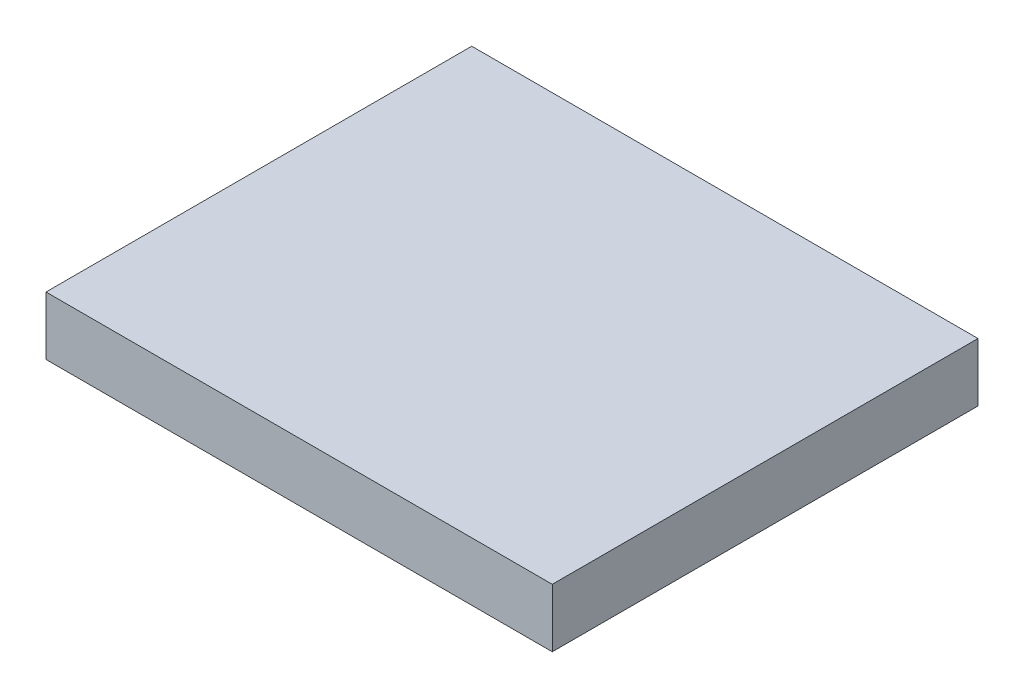
ISO-10303-21;
HEADER;
FILE_DESCRIPTION(('STEP AP214'),'2;1');
FILE_NAME('part.step','',(''),(''),'','','');
FILE_SCHEMA(('AUTOMOTIVE_DESIGN { 1 0 10303 214 1 1 1 1 }'));
ENDSEC;
DATA;
#1=APPLICATION_CONTEXT('core data for automotive mechanical design processes');
#2=APPLICATION_PROTOCOL_DEFINITION('international standard','automotive_design',2000,#1);
#3=PRODUCT_CONTEXT('',#1,'mechanical');
#4=PRODUCT('Part','Part','',(#3));
#5=PRODUCT_RELATED_PRODUCT_CATEGORY('part','',(#4));
#6=PRODUCT_DEFINITION_FORMATION('','',#4);
#7=PRODUCT_DEFINITION_CONTEXT('part definition',#1,'design');
#8=PRODUCT_DEFINITION('design','',#6,#7);
#9=PRODUCT_DEFINITION_SHAPE('','',#8);
#10=(LENGTH_UNIT() NAMED_UNIT(*) SI_UNIT(.MILLI.,.METRE.));
#11=(NAMED_UNIT(*) PLANE_ANGLE_UNIT() SI_UNIT($,.RADIAN.));
#12=(NAMED_UNIT(*) SI_UNIT($,.STERADIAN.) SOLID_ANGLE_UNIT());
#13=UNCERTAINTY_MEASURE_WITH_UNIT(LENGTH_MEASURE(1.E-05),#10,'distance_accuracy_value','');
#14=(GEOMETRIC_REPRESENTATION_CONTEXT(3) GLOBAL_UNCERTAINTY_ASSIGNED_CONTEXT((#13)) GLOBAL_UNIT_ASSIGNED_CONTEXT((#10,
#11,#12)) REPRESENTATION_CONTEXT('',''));
#15=CARTESIAN_POINT('',(0.,0.,0.));
#16=DIRECTION('',(0.,0.,1.));
#17=DIRECTION('',(1.,0.,0.));
#18=AXIS2_PLACEMENT_3D('',#15,#16,#17);
#19=CARTESIAN_POINT('',(110.,25.4,-92.5));
#20=DIRECTION('',(-1.,0.,0.));
#21=DIRECTION('',(0.,0.,1.));
#22=AXIS2_PLACEMENT_3D('',#19,#20,#21);
#23=PLANE('',#22);
#24=DIRECTION('',(0.,0.,-1.));
#25=VECTOR('',#24,1.);
#26=CARTESIAN_POINT('',(110.,0.,-92.5));
#27=LINE('',#26,#25);
#28=CARTESIAN_POINT('',(110.,0.,92.5));
#29=VERTEX_POINT('',#28);
#30=CARTESIAN_POINT('',(110.,0.,-92.5));
#31=VERTEX_POINT('',#30);
#32=EDGE_CURVE('E96',#29,#31,#27,.T.);
#33=ORIENTED_EDGE('',*,*,#32,.T.);
#34=DIRECTION('',(0.,-1.,0.));
#35=VECTOR('',#34,1.);
#36=CARTESIAN_POINT('',(110.,25.4,-92.5));
#37=LINE('',#36,#35);
#38=CARTESIAN_POINT('',(110.,25.4,-92.5));
#39=VERTEX_POINT('',#38);
#40=EDGE_CURVE('E11',#39,#31,#37,.T.);
#41=ORIENTED_EDGE('',*,*,#40,.F.);
#42=DIRECTION('',(0.,0.,-1.));
#43=VECTOR('',#42,1.);
#44=CARTESIAN_POINT('',(110.,25.4,-92.5));
#45=LINE('',#44,#43);
#46=CARTESIAN_POINT('',(110.,25.4,92.5));
#47=VERTEX_POINT('',#46);
#48=EDGE_CURVE('E84',#47,#39,#45,.T.);
#49=ORIENTED_EDGE('',*,*,#48,.F.);
#50=DIRECTION('',(0.,-1.,0.));
#51=VECTOR('',#50,1.);
#52=CARTESIAN_POINT('',(110.,25.4,92.5));
#53=LINE('',#52,#51);
#54=EDGE_CURVE('E92',#47,#29,#53,.T.);
#55=ORIENTED_EDGE('',*,*,#54,.T.);
#56=EDGE_LOOP('',(#33,#41,#49,#55));
#57=FACE_BOUND('',#56,.T.);
#58=ADVANCED_FACE('F33',(#57),#23,.F.);
#59=CARTESIAN_POINT('',(-110.,25.4,-92.5));
#60=DIRECTION('',(0.,0.,1.));
#61=DIRECTION('',(1.,0.,0.));
#62=AXIS2_PLACEMENT_3D('',#59,#60,#61);
#63=PLANE('',#62);
#64=DIRECTION('',(-1.,0.,0.));
#65=VECTOR('',#64,1.);
#66=CARTESIAN_POINT('',(-110.,0.,-92.5));
#67=LINE('',#66,#65);
#68=CARTESIAN_POINT('',(-110.,0.,-92.5));
#69=VERTEX_POINT('',#68);
#70=EDGE_CURVE('E88',#31,#69,#67,.T.);
#71=ORIENTED_EDGE('',*,*,#70,.T.);
#72=DIRECTION('',(0.,-1.,0.));
#73=VECTOR('',#72,1.);
#74=CARTESIAN_POINT('',(-110.,25.4,-92.5));
#75=LINE('',#74,#73);
#76=CARTESIAN_POINT('',(-110.,25.4,-92.5));
#77=VERTEX_POINT('',#76);
#78=EDGE_CURVE('E41',#77,#69,#75,.T.);
#79=ORIENTED_EDGE('',*,*,#78,.F.);
#80=DIRECTION('',(-1.,0.,0.));
#81=VECTOR('',#80,1.);
#82=CARTESIAN_POINT('',(-110.,25.4,-92.5));
#83=LINE('',#82,#81);
#84=EDGE_CURVE('E79',#39,#77,#83,.T.);
#85=ORIENTED_EDGE('',*,*,#84,.F.);
#86=ORIENTED_EDGE('',*,*,#40,.T.);
#87=EDGE_LOOP('',(#71,#79,#85,#86));
#88=FACE_BOUND('',#87,.T.);
#89=ADVANCED_FACE('F87',(#88),#63,.F.);
#90=CARTESIAN_POINT('',(-110.,25.4,-92.5));
#91=DIRECTION('',(1.,0.,0.));
#92=DIRECTION('',(0.,0.,-1.));
#93=AXIS2_PLACEMENT_3D('',#90,#91,#92);
#94=PLANE('',#93);
#95=DIRECTION('',(0.,0.,1.));
#96=VECTOR('',#95,1.);
#97=CARTESIAN_POINT('',(-110.,0.,-92.5));
#98=LINE('',#97,#96);
#99=CARTESIAN_POINT('',(-110.,0.,92.5));
#100=VERTEX_POINT('',#99);
#101=EDGE_CURVE('E66',#69,#100,#98,.T.);
#102=ORIENTED_EDGE('',*,*,#101,.T.);
#103=DIRECTION('',(0.,-1.,0.));
#104=VECTOR('',#103,1.);
#105=CARTESIAN_POINT('',(-110.,25.4,92.5));
#106=LINE('',#105,#104);
#107=CARTESIAN_POINT('',(-110.,25.4,92.5));
#108=VERTEX_POINT('',#107);
#109=EDGE_CURVE('E89',#108,#100,#106,.T.);
#110=ORIENTED_EDGE('',*,*,#109,.F.);
#111=DIRECTION('',(0.,0.,1.));
#112=VECTOR('',#111,1.);
#113=CARTESIAN_POINT('',(-110.,25.4,-92.5));
#114=LINE('',#113,#112);
#115=EDGE_CURVE('E82',#77,#108,#114,.T.);
#116=ORIENTED_EDGE('',*,*,#115,.F.);
#117=ORIENTED_EDGE('',*,*,#78,.T.);
#118=EDGE_LOOP('',(#102,#110,#116,#117));
#119=FACE_BOUND('',#118,.T.);
#120=ADVANCED_FACE('F90',(#119),#94,.F.);
#121=CARTESIAN_POINT('',(-110.,25.4,92.5));
#122=DIRECTION('',(0.,0.,-1.));
#123=DIRECTION('',(-1.,0.,0.));
#124=AXIS2_PLACEMENT_3D('',#121,#122,#123);
#125=PLANE('',#124);
#126=DIRECTION('',(1.,0.,0.));
#127=VECTOR('',#126,1.);
#128=CARTESIAN_POINT('',(-110.,0.,92.5));
#129=LINE('',#128,#127);
#130=EDGE_CURVE('E72',#100,#29,#129,.T.);
#131=ORIENTED_EDGE('',*,*,#130,.T.);
#132=ORIENTED_EDGE('',*,*,#54,.F.);
#133=DIRECTION('',(1.,0.,0.));
#134=VECTOR('',#133,1.);
#135=CARTESIAN_POINT('',(-110.,25.4,92.5));
#136=LINE('',#135,#134);
#137=EDGE_CURVE('E49',#108,#47,#136,.T.);
#138=ORIENTED_EDGE('',*,*,#137,.F.);
#139=ORIENTED_EDGE('',*,*,#109,.T.);
#140=EDGE_LOOP('',(#131,#132,#138,#139));
#141=FACE_BOUND('',#140,.T.);
#142=ADVANCED_FACE('F103',(#141),#125,.F.);
#143=CARTESIAN_POINT('',(0.,25.4,0.));
#144=DIRECTION('',(0.,1.,0.));
#145=DIRECTION('',(0.,0.,1.));
#146=AXIS2_PLACEMENT_3D('',#143,#144,#145);
#147=PLANE('',#146);
#148=ORIENTED_EDGE('',*,*,#48,.T.);
#149=ORIENTED_EDGE('',*,*,#84,.T.);
#150=ORIENTED_EDGE('',*,*,#115,.T.);
#151=ORIENTED_EDGE('',*,*,#137,.T.);
#152=EDGE_LOOP('',(#148,#149,#150,#151));
#153=FACE_BOUND('',#152,.T.);
#154=ADVANCED_FACE('F80',(#153),#147,.T.);
#155=CARTESIAN_POINT('',(0.,0.,0.));
#156=DIRECTION('',(0.,1.,0.));
#157=DIRECTION('',(0.,0.,1.));
#158=AXIS2_PLACEMENT_3D('',#155,#156,#157);
#159=PLANE('',#158);
#160=ORIENTED_EDGE('',*,*,#32,.F.);
#161=ORIENTED_EDGE('',*,*,#130,.F.);
#162=ORIENTED_EDGE('',*,*,#101,.F.);
#163=ORIENTED_EDGE('',*,*,#70,.F.);
#164=EDGE_LOOP('',(#160,#161,#162,#163));
#165=FACE_BOUND('',#164,.T.);
#166=ADVANCED_FACE('F106',(#165),#159,.F.);
#167=CLOSED_SHELL('',(#58,#89,#120,#142,#154,#166));
#168=MANIFOLD_SOLID_BREP('B2',#167);
#169=ADVANCED_BREP_SHAPE_REPRESENTATION('',(#18,#168),#14);
#170=SHAPE_DEFINITION_REPRESENTATION(#9,#169);
ENDSEC;
END-ISO-10303-21;
